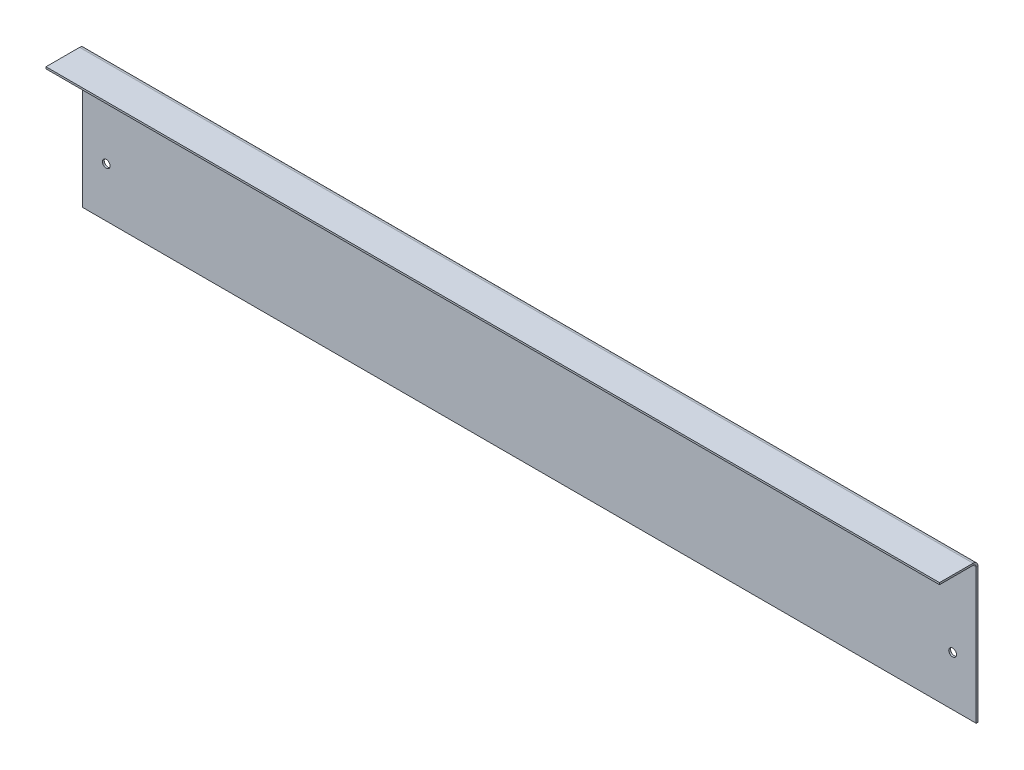
ISO-10303-21;
HEADER;
FILE_DESCRIPTION(('STEP AP214'),'2;1');
FILE_NAME('part.step','',(''),(''),'','','');
FILE_SCHEMA(('AUTOMOTIVE_DESIGN { 1 0 10303 214 1 1 1 1 }'));
ENDSEC;
DATA;
#1=APPLICATION_CONTEXT('core data for automotive mechanical design processes');
#2=APPLICATION_PROTOCOL_DEFINITION('international standard','automotive_design',2000,#1);
#3=PRODUCT_CONTEXT('',#1,'mechanical');
#4=PRODUCT('Part','Part','',(#3));
#5=PRODUCT_RELATED_PRODUCT_CATEGORY('part','',(#4));
#6=PRODUCT_DEFINITION_FORMATION('','',#4);
#7=PRODUCT_DEFINITION_CONTEXT('part definition',#1,'design');
#8=PRODUCT_DEFINITION('design','',#6,#7);
#9=PRODUCT_DEFINITION_SHAPE('','',#8);
#10=(LENGTH_UNIT() NAMED_UNIT(*) SI_UNIT(.MILLI.,.METRE.));
#11=(NAMED_UNIT(*) PLANE_ANGLE_UNIT() SI_UNIT($,.RADIAN.));
#12=(NAMED_UNIT(*) SI_UNIT($,.STERADIAN.) SOLID_ANGLE_UNIT());
#13=UNCERTAINTY_MEASURE_WITH_UNIT(LENGTH_MEASURE(1.E-05),#10,'distance_accuracy_value','');
#14=(GEOMETRIC_REPRESENTATION_CONTEXT(3) GLOBAL_UNCERTAINTY_ASSIGNED_CONTEXT((#13)) GLOBAL_UNIT_ASSIGNED_CONTEXT((#10,
#11,#12)) REPRESENTATION_CONTEXT('',''));
#15=CARTESIAN_POINT('',(0.,0.,0.));
#16=DIRECTION('',(0.,0.,1.));
#17=DIRECTION('',(1.,0.,0.));
#18=AXIS2_PLACEMENT_3D('',#15,#16,#17);
#19=CARTESIAN_POINT('',(0.,0.,-1.2));
#20=DIRECTION('',(-1.,0.,0.));
#21=DIRECTION('',(0.,0.,1.));
#22=AXIS2_PLACEMENT_3D('',#19,#20,#21);
#23=PLANE('',#22);
#24=DIRECTION('',(0.,-1.,0.));
#25=VECTOR('',#24,1.);
#26=CARTESIAN_POINT('',(0.,0.,0.));
#27=LINE('',#26,#25);
#28=CARTESIAN_POINT('',(0.,87.8,0.));
#29=VERTEX_POINT('',#28);
#30=CARTESIAN_POINT('',(0.,0.,0.));
#31=VERTEX_POINT('',#30);
#32=EDGE_CURVE('E131',#29,#31,#27,.T.);
#33=ORIENTED_EDGE('',*,*,#32,.F.);
#34=DIRECTION('',(0.,0.,-1.));
#35=VECTOR('',#34,1.);
#36=CARTESIAN_POINT('',(0.,87.8,0.));
#37=LINE('',#36,#35);
#38=CARTESIAN_POINT('',(0.,87.8,-1.20000000000001));
#39=VERTEX_POINT('',#38);
#40=EDGE_CURVE('E193',#29,#39,#37,.T.);
#41=ORIENTED_EDGE('',*,*,#40,.T.);
#42=DIRECTION('',(0.,-1.,0.));
#43=VECTOR('',#42,1.);
#44=CARTESIAN_POINT('',(0.,0.,-1.2));
#45=LINE('',#44,#43);
#46=CARTESIAN_POINT('',(0.,0.,-1.2));
#47=VERTEX_POINT('',#46);
#48=EDGE_CURVE('E127',#39,#47,#45,.T.);
#49=ORIENTED_EDGE('',*,*,#48,.T.);
#50=DIRECTION('',(0.,0.,1.));
#51=VECTOR('',#50,1.);
#52=CARTESIAN_POINT('',(0.,0.,-1.2));
#53=LINE('',#52,#51);
#54=EDGE_CURVE('E85',#47,#31,#53,.T.);
#55=ORIENTED_EDGE('',*,*,#54,.T.);
#56=EDGE_LOOP('',(#33,#41,#49,#55));
#57=FACE_BOUND('',#56,.T.);
#58=ADVANCED_FACE('F77',(#57),#23,.T.);
#59=CARTESIAN_POINT('',(0.,0.,-1.2));
#60=DIRECTION('',(0.,0.,-1.));
#61=DIRECTION('',(-1.,0.,0.));
#62=AXIS2_PLACEMENT_3D('',#59,#60,#61);
#63=PLANE('',#62);
#64=CARTESIAN_POINT('',(564.699999999905,32.2000000000983,-1.2));
#65=DIRECTION('',(0.,0.,-1.));
#66=DIRECTION('',(-1.,0.,0.));
#67=AXIS2_PLACEMENT_3D('',#64,#65,#66);
#68=CIRCLE('',#67,2.49999999999992);
#69=CARTESIAN_POINT('',(562.199999999905,32.2000000000983,-1.2));
#70=VERTEX_POINT('',#69);
#71=EDGE_CURVE('E141',#70,#70,#68,.F.);
#72=ORIENTED_EDGE('',*,*,#71,.T.);
#73=EDGE_LOOP('',(#72));
#74=FACE_BOUND('',#73,.T.);
#75=CARTESIAN_POINT('',(15.3000000000952,32.2000000000983,-1.19999999999998));
#76=DIRECTION('',(0.,0.,-1.));
#77=DIRECTION('',(-1.,0.,0.));
#78=AXIS2_PLACEMENT_3D('',#75,#76,#77);
#79=CIRCLE('',#78,2.5);
#80=CARTESIAN_POINT('',(12.8000000000952,32.2000000000983,-1.19999999999998));
#81=VERTEX_POINT('',#80);
#82=EDGE_CURVE('E140',#81,#81,#79,.T.);
#83=ORIENTED_EDGE('',*,*,#82,.F.);
#84=EDGE_LOOP('',(#83));
#85=FACE_BOUND('',#84,.T.);
#86=ORIENTED_EDGE('',*,*,#48,.F.);
#87=DIRECTION('',(-1.,0.,0.));
#88=VECTOR('',#87,1.);
#89=CARTESIAN_POINT('',(0.,87.8,-1.20000000000001));
#90=LINE('',#89,#88);
#91=CARTESIAN_POINT('',(580.,87.8,-1.2));
#92=VERTEX_POINT('',#91);
#93=EDGE_CURVE('E188',#39,#92,#90,.F.);
#94=ORIENTED_EDGE('',*,*,#93,.T.);
#95=DIRECTION('',(0.,1.,0.));
#96=VECTOR('',#95,1.);
#97=CARTESIAN_POINT('',(580.,0.,-1.2));
#98=LINE('',#97,#96);
#99=CARTESIAN_POINT('',(580.,0.,-1.2));
#100=VERTEX_POINT('',#99);
#101=EDGE_CURVE('E137',#100,#92,#98,.T.);
#102=ORIENTED_EDGE('',*,*,#101,.F.);
#103=DIRECTION('',(1.,0.,0.));
#104=VECTOR('',#103,1.);
#105=CARTESIAN_POINT('',(0.,0.,-1.2));
#106=LINE('',#105,#104);
#107=EDGE_CURVE('E118',#47,#100,#106,.T.);
#108=ORIENTED_EDGE('',*,*,#107,.F.);
#109=EDGE_LOOP('',(#86,#94,#102,#108));
#110=FACE_BOUND('',#109,.T.);
#111=ADVANCED_FACE('F210',(#74,#85,#110),#63,.T.);
#112=CARTESIAN_POINT('',(0.,0.,0.));
#113=DIRECTION('',(0.,0.,-1.));
#114=DIRECTION('',(-1.,0.,0.));
#115=AXIS2_PLACEMENT_3D('',#112,#113,#114);
#116=PLANE('',#115);
#117=CARTESIAN_POINT('',(564.699999999905,32.2000000000983,0.));
#118=DIRECTION('',(0.,0.,-1.));
#119=DIRECTION('',(-1.,0.,0.));
#120=AXIS2_PLACEMENT_3D('',#117,#118,#119);
#121=CIRCLE('',#120,2.49999999999992);
#122=CARTESIAN_POINT('',(562.199999999905,32.2000000000983,0.));
#123=VERTEX_POINT('',#122);
#124=EDGE_CURVE('E80',#123,#123,#121,.F.);
#125=ORIENTED_EDGE('',*,*,#124,.F.);
#126=EDGE_LOOP('',(#125));
#127=FACE_BOUND('',#126,.T.);
#128=CARTESIAN_POINT('',(15.3000000000952,32.2000000000983,0.));
#129=DIRECTION('',(0.,0.,-1.));
#130=DIRECTION('',(-1.,0.,0.));
#131=AXIS2_PLACEMENT_3D('',#128,#129,#130);
#132=CIRCLE('',#131,2.5);
#133=CARTESIAN_POINT('',(12.8000000000952,32.2000000000983,0.));
#134=VERTEX_POINT('',#133);
#135=EDGE_CURVE('E138',#134,#134,#132,.T.);
#136=ORIENTED_EDGE('',*,*,#135,.T.);
#137=EDGE_LOOP('',(#136));
#138=FACE_BOUND('',#137,.T.);
#139=DIRECTION('',(-1.,0.,0.));
#140=VECTOR('',#139,1.);
#141=CARTESIAN_POINT('',(0.,87.8,0.));
#142=LINE('',#141,#140);
#143=CARTESIAN_POINT('',(580.,87.8,0.));
#144=VERTEX_POINT('',#143);
#145=EDGE_CURVE('E199',#29,#144,#142,.F.);
#146=ORIENTED_EDGE('',*,*,#145,.F.);
#147=ORIENTED_EDGE('',*,*,#32,.T.);
#148=DIRECTION('',(1.,0.,0.));
#149=VECTOR('',#148,1.);
#150=CARTESIAN_POINT('',(0.,0.,0.));
#151=LINE('',#150,#149);
#152=CARTESIAN_POINT('',(580.,0.,0.));
#153=VERTEX_POINT('',#152);
#154=EDGE_CURVE('E116',#31,#153,#151,.T.);
#155=ORIENTED_EDGE('',*,*,#154,.T.);
#156=DIRECTION('',(0.,1.,0.));
#157=VECTOR('',#156,1.);
#158=CARTESIAN_POINT('',(580.,0.,0.));
#159=LINE('',#158,#157);
#160=EDGE_CURVE('E121',#153,#144,#159,.T.);
#161=ORIENTED_EDGE('',*,*,#160,.T.);
#162=EDGE_LOOP('',(#146,#147,#155,#161));
#163=FACE_BOUND('',#162,.T.);
#164=ADVANCED_FACE('F129',(#127,#138,#163),#116,.F.);
#165=CARTESIAN_POINT('',(580.,0.,-1.2));
#166=DIRECTION('',(1.,0.,0.));
#167=DIRECTION('',(0.,0.,-1.));
#168=AXIS2_PLACEMENT_3D('',#165,#166,#167);
#169=PLANE('',#168);
#170=DIRECTION('',(0.,0.,-1.));
#171=VECTOR('',#170,1.);
#172=CARTESIAN_POINT('',(580.,87.8,0.));
#173=LINE('',#172,#171);
#174=EDGE_CURVE('E124',#144,#92,#173,.T.);
#175=ORIENTED_EDGE('',*,*,#174,.F.);
#176=ORIENTED_EDGE('',*,*,#160,.F.);
#177=DIRECTION('',(0.,0.,1.));
#178=VECTOR('',#177,1.);
#179=CARTESIAN_POINT('',(580.,0.,-1.2));
#180=LINE('',#179,#178);
#181=EDGE_CURVE('E14',#100,#153,#180,.T.);
#182=ORIENTED_EDGE('',*,*,#181,.F.);
#183=ORIENTED_EDGE('',*,*,#101,.T.);
#184=EDGE_LOOP('',(#175,#176,#182,#183));
#185=FACE_BOUND('',#184,.T.);
#186=ADVANCED_FACE('F122',(#185),#169,.T.);
#187=CARTESIAN_POINT('',(0.,0.,-1.2));
#188=DIRECTION('',(0.,-1.,0.));
#189=DIRECTION('',(0.,0.,-1.));
#190=AXIS2_PLACEMENT_3D('',#187,#188,#189);
#191=PLANE('',#190);
#192=ORIENTED_EDGE('',*,*,#154,.F.);
#193=ORIENTED_EDGE('',*,*,#54,.F.);
#194=ORIENTED_EDGE('',*,*,#107,.T.);
#195=ORIENTED_EDGE('',*,*,#181,.T.);
#196=EDGE_LOOP('',(#192,#193,#194,#195));
#197=FACE_BOUND('',#196,.T.);
#198=ADVANCED_FACE('F113',(#197),#191,.T.);
#199=CARTESIAN_POINT('',(580.,87.8,1.99999999999999));
#200=DIRECTION('',(1.,0.,0.));
#201=DIRECTION('',(0.,0.,-1.));
#202=AXIS2_PLACEMENT_3D('',#199,#200,#201);
#203=PLANE('',#202);
#204=DIRECTION('',(0.,-1.,0.));
#205=VECTOR('',#204,1.);
#206=CARTESIAN_POINT('',(580.,91.,1.99999999999998));
#207=LINE('',#206,#205);
#208=CARTESIAN_POINT('',(580.,89.8,1.99999999999999));
#209=VERTEX_POINT('',#208);
#210=CARTESIAN_POINT('',(580.,91.,1.99999999999998));
#211=VERTEX_POINT('',#210);
#212=EDGE_CURVE('E145',#209,#211,#207,.F.);
#213=ORIENTED_EDGE('',*,*,#212,.F.);
#214=CARTESIAN_POINT('',(580.,87.8,1.99999999999999));
#215=DIRECTION('',(-1.,0.,0.));
#216=DIRECTION('',(0.,0.,1.));
#217=AXIS2_PLACEMENT_3D('',#214,#215,#216);
#218=CIRCLE('',#217,2.);
#219=EDGE_CURVE('E196',#144,#209,#218,.F.);
#220=ORIENTED_EDGE('',*,*,#219,.F.);
#221=ORIENTED_EDGE('',*,*,#174,.T.);
#222=CARTESIAN_POINT('',(580.,87.8,1.99999999999999));
#223=DIRECTION('',(-1.,0.,0.));
#224=DIRECTION('',(0.,0.,1.));
#225=AXIS2_PLACEMENT_3D('',#222,#223,#224);
#226=CIRCLE('',#225,3.2);
#227=EDGE_CURVE('E93',#92,#211,#226,.F.);
#228=ORIENTED_EDGE('',*,*,#227,.T.);
#229=EDGE_LOOP('',(#213,#220,#221,#228));
#230=FACE_BOUND('',#229,.T.);
#231=ADVANCED_FACE('F246',(#230),#203,.T.);
#232=CARTESIAN_POINT('',(0.,87.8,1.99999999999999));
#233=DIRECTION('',(1.,0.,0.));
#234=DIRECTION('',(0.,0.,-1.));
#235=AXIS2_PLACEMENT_3D('',#232,#233,#234);
#236=PLANE('',#235);
#237=CARTESIAN_POINT('',(0.,87.8,1.99999999999999));
#238=DIRECTION('',(-1.,0.,0.));
#239=DIRECTION('',(0.,0.,1.));
#240=AXIS2_PLACEMENT_3D('',#237,#238,#239);
#241=CIRCLE('',#240,2.);
#242=CARTESIAN_POINT('',(0.,89.8,1.99999999999999));
#243=VERTEX_POINT('',#242);
#244=EDGE_CURVE('E156',#243,#29,#241,.T.);
#245=ORIENTED_EDGE('',*,*,#244,.F.);
#246=DIRECTION('',(0.,-1.,0.));
#247=VECTOR('',#246,1.);
#248=CARTESIAN_POINT('',(0.,89.8,1.99999999999999));
#249=LINE('',#248,#247);
#250=CARTESIAN_POINT('',(0.,91.,1.99999999999998));
#251=VERTEX_POINT('',#250);
#252=EDGE_CURVE('E180',#243,#251,#249,.F.);
#253=ORIENTED_EDGE('',*,*,#252,.T.);
#254=CARTESIAN_POINT('',(0.,87.8,1.99999999999999));
#255=DIRECTION('',(-1.,0.,0.));
#256=DIRECTION('',(0.,0.,1.));
#257=AXIS2_PLACEMENT_3D('',#254,#255,#256);
#258=CIRCLE('',#257,3.2);
#259=EDGE_CURVE('E191',#251,#39,#258,.T.);
#260=ORIENTED_EDGE('',*,*,#259,.T.);
#261=ORIENTED_EDGE('',*,*,#40,.F.);
#262=EDGE_LOOP('',(#245,#253,#260,#261));
#263=FACE_BOUND('',#262,.T.);
#264=ADVANCED_FACE('F219',(#263),#236,.F.);
#265=CARTESIAN_POINT('',(0.,87.8,1.99999999999999));
#266=DIRECTION('',(-1.,0.,0.));
#267=DIRECTION('',(0.,1.,0.));
#268=AXIS2_PLACEMENT_3D('',#265,#266,#267);
#269=CYLINDRICAL_SURFACE('',#268,3.2);
#270=ORIENTED_EDGE('',*,*,#93,.F.);
#271=ORIENTED_EDGE('',*,*,#259,.F.);
#272=DIRECTION('',(-1.,0.,0.));
#273=VECTOR('',#272,1.);
#274=CARTESIAN_POINT('',(580.,91.,1.99999999999998));
#275=LINE('',#274,#273);
#276=EDGE_CURVE('E178',#251,#211,#275,.F.);
#277=ORIENTED_EDGE('',*,*,#276,.T.);
#278=ORIENTED_EDGE('',*,*,#227,.F.);
#279=EDGE_LOOP('',(#270,#271,#277,#278));
#280=FACE_BOUND('',#279,.T.);
#281=ADVANCED_FACE('F212',(#280),#269,.T.);
#282=CARTESIAN_POINT('',(0.,87.8,1.99999999999999));
#283=DIRECTION('',(-1.,0.,0.));
#284=DIRECTION('',(0.,1.,0.));
#285=AXIS2_PLACEMENT_3D('',#282,#283,#284);
#286=CYLINDRICAL_SURFACE('',#285,2.);
#287=ORIENTED_EDGE('',*,*,#145,.T.);
#288=ORIENTED_EDGE('',*,*,#219,.T.);
#289=DIRECTION('',(-1.,0.,0.));
#290=VECTOR('',#289,1.);
#291=CARTESIAN_POINT('',(580.,89.8,1.99999999999999));
#292=LINE('',#291,#290);
#293=EDGE_CURVE('E183',#209,#243,#292,.T.);
#294=ORIENTED_EDGE('',*,*,#293,.T.);
#295=ORIENTED_EDGE('',*,*,#244,.T.);
#296=EDGE_LOOP('',(#287,#288,#294,#295));
#297=FACE_BOUND('',#296,.T.);
#298=ADVANCED_FACE('F290',(#297),#286,.F.);
#299=CARTESIAN_POINT('',(580.,91.,0.));
#300=DIRECTION('',(-1.,0.,0.));
#301=DIRECTION('',(0.,0.,1.));
#302=AXIS2_PLACEMENT_3D('',#299,#300,#301);
#303=PLANE('',#302);
#304=ORIENTED_EDGE('',*,*,#212,.T.);
#305=DIRECTION('',(0.,0.,-1.));
#306=VECTOR('',#305,1.);
#307=CARTESIAN_POINT('',(580.,91.,-3.22562556727061E-13));
#308=LINE('',#307,#306);
#309=CARTESIAN_POINT('',(580.,91.0000000000001,23.8));
#310=VERTEX_POINT('',#309);
#311=EDGE_CURVE('E166',#310,#211,#308,.T.);
#312=ORIENTED_EDGE('',*,*,#311,.F.);
#313=DIRECTION('',(0.,-1.,0.));
#314=VECTOR('',#313,1.);
#315=CARTESIAN_POINT('',(580.,91.0000000000001,23.8));
#316=LINE('',#315,#314);
#317=CARTESIAN_POINT('',(580.,89.8000000000001,23.8));
#318=VERTEX_POINT('',#317);
#319=EDGE_CURVE('E157',#310,#318,#316,.T.);
#320=ORIENTED_EDGE('',*,*,#319,.T.);
#321=DIRECTION('',(0.,0.,1.));
#322=VECTOR('',#321,1.);
#323=CARTESIAN_POINT('',(580.,89.8,0.));
#324=LINE('',#323,#322);
#325=EDGE_CURVE('E175',#318,#209,#324,.F.);
#326=ORIENTED_EDGE('',*,*,#325,.T.);
#327=EDGE_LOOP('',(#304,#312,#320,#326));
#328=FACE_BOUND('',#327,.T.);
#329=ADVANCED_FACE('F249',(#328),#303,.F.);
#330=CARTESIAN_POINT('',(0.,91.0000000000001,23.8));
#331=DIRECTION('',(1.,0.,0.));
#332=DIRECTION('',(0.,0.,-1.));
#333=AXIS2_PLACEMENT_3D('',#330,#331,#332);
#334=PLANE('',#333);
#335=ORIENTED_EDGE('',*,*,#252,.F.);
#336=DIRECTION('',(0.,0.,-1.));
#337=VECTOR('',#336,1.);
#338=CARTESIAN_POINT('',(0.,89.8000000000001,23.8));
#339=LINE('',#338,#337);
#340=CARTESIAN_POINT('',(0.,89.8000000000001,23.8));
#341=VERTEX_POINT('',#340);
#342=EDGE_CURVE('E172',#243,#341,#339,.F.);
#343=ORIENTED_EDGE('',*,*,#342,.T.);
#344=DIRECTION('',(0.,-1.,0.));
#345=VECTOR('',#344,1.);
#346=CARTESIAN_POINT('',(0.,91.0000000000001,23.8));
#347=LINE('',#346,#345);
#348=CARTESIAN_POINT('',(0.,91.0000000000001,23.8));
#349=VERTEX_POINT('',#348);
#350=EDGE_CURVE('E153',#349,#341,#347,.T.);
#351=ORIENTED_EDGE('',*,*,#350,.F.);
#352=DIRECTION('',(0.,0.,1.));
#353=VECTOR('',#352,1.);
#354=CARTESIAN_POINT('',(0.,91.,-3.22562556727061E-13));
#355=LINE('',#354,#353);
#356=EDGE_CURVE('E163',#251,#349,#355,.T.);
#357=ORIENTED_EDGE('',*,*,#356,.F.);
#358=EDGE_LOOP('',(#335,#343,#351,#357));
#359=FACE_BOUND('',#358,.T.);
#360=ADVANCED_FACE('F254',(#359),#334,.F.);
#361=CARTESIAN_POINT('',(0.,91.,-3.22562556727061E-13));
#362=DIRECTION('',(0.,-1.,0.));
#363=DIRECTION('',(0.,0.,-1.));
#364=AXIS2_PLACEMENT_3D('',#361,#362,#363);
#365=PLANE('',#364);
#366=ORIENTED_EDGE('',*,*,#276,.F.);
#367=ORIENTED_EDGE('',*,*,#356,.T.);
#368=DIRECTION('',(1.,0.,0.));
#369=VECTOR('',#368,1.);
#370=CARTESIAN_POINT('',(0.,91.0000000000001,23.8));
#371=LINE('',#370,#369);
#372=EDGE_CURVE('E160',#349,#310,#371,.T.);
#373=ORIENTED_EDGE('',*,*,#372,.T.);
#374=ORIENTED_EDGE('',*,*,#311,.T.);
#375=EDGE_LOOP('',(#366,#367,#373,#374));
#376=FACE_BOUND('',#375,.T.);
#377=ADVANCED_FACE('F251',(#376),#365,.F.);
#378=CARTESIAN_POINT('',(0.,89.8,-3.18372779120449E-13));
#379=DIRECTION('',(0.,-1.,0.));
#380=DIRECTION('',(0.,0.,-1.));
#381=AXIS2_PLACEMENT_3D('',#378,#379,#380);
#382=PLANE('',#381);
#383=ORIENTED_EDGE('',*,*,#342,.F.);
#384=ORIENTED_EDGE('',*,*,#293,.F.);
#385=ORIENTED_EDGE('',*,*,#325,.F.);
#386=DIRECTION('',(-1.,0.,0.));
#387=VECTOR('',#386,1.);
#388=CARTESIAN_POINT('',(580.,89.8000000000001,23.8));
#389=LINE('',#388,#387);
#390=EDGE_CURVE('E169',#341,#318,#389,.F.);
#391=ORIENTED_EDGE('',*,*,#390,.F.);
#392=EDGE_LOOP('',(#383,#384,#385,#391));
#393=FACE_BOUND('',#392,.T.);
#394=ADVANCED_FACE('F253',(#393),#382,.T.);
#395=CARTESIAN_POINT('',(580.,91.0000000000001,23.8));
#396=DIRECTION('',(0.,0.,-1.));
#397=DIRECTION('',(0.,1.,0.));
#398=AXIS2_PLACEMENT_3D('',#395,#396,#397);
#399=PLANE('',#398);
#400=ORIENTED_EDGE('',*,*,#390,.T.);
#401=ORIENTED_EDGE('',*,*,#319,.F.);
#402=ORIENTED_EDGE('',*,*,#372,.F.);
#403=ORIENTED_EDGE('',*,*,#350,.T.);
#404=EDGE_LOOP('',(#400,#401,#402,#403));
#405=FACE_BOUND('',#404,.T.);
#406=ADVANCED_FACE('F260',(#405),#399,.F.);
#407=CARTESIAN_POINT('',(15.3000000000952,32.2000000000983,-534.818311308449));
#408=DIRECTION('',(0.,0.,1.));
#409=DIRECTION('',(1.,0.,0.));
#410=AXIS2_PLACEMENT_3D('',#407,#408,#409);
#411=CYLINDRICAL_SURFACE('',#410,2.5);
#412=ORIENTED_EDGE('',*,*,#82,.T.);
#413=EDGE_LOOP('',(#412));
#414=FACE_BOUND('',#413,.T.);
#415=ORIENTED_EDGE('',*,*,#135,.F.);
#416=EDGE_LOOP('',(#415));
#417=FACE_BOUND('',#416,.T.);
#418=ADVANCED_FACE('F299',(#414,#417),#411,.F.);
#419=CARTESIAN_POINT('',(564.699999999905,32.2000000000983,23.8));
#420=DIRECTION('',(0.,0.,-1.));
#421=DIRECTION('',(-1.,0.,0.));
#422=AXIS2_PLACEMENT_3D('',#419,#420,#421);
#423=CYLINDRICAL_SURFACE('',#422,2.49999999999992);
#424=ORIENTED_EDGE('',*,*,#71,.F.);
#425=EDGE_LOOP('',(#424));
#426=FACE_BOUND('',#425,.T.);
#427=ORIENTED_EDGE('',*,*,#124,.T.);
#428=EDGE_LOOP('',(#427));
#429=FACE_BOUND('',#428,.T.);
#430=ADVANCED_FACE('F303',(#426,#429),#423,.F.);
#431=CLOSED_SHELL('',(#58,#111,#164,#186,#198,#231,#264,#281,#298,#329,#360,#377,#394,#406,#418,#430));
#432=MANIFOLD_SOLID_BREP('B2',#431);
#433=ADVANCED_BREP_SHAPE_REPRESENTATION('',(#18,#432),#14);
#434=SHAPE_DEFINITION_REPRESENTATION(#9,#433);
ENDSEC;
END-ISO-10303-21;
